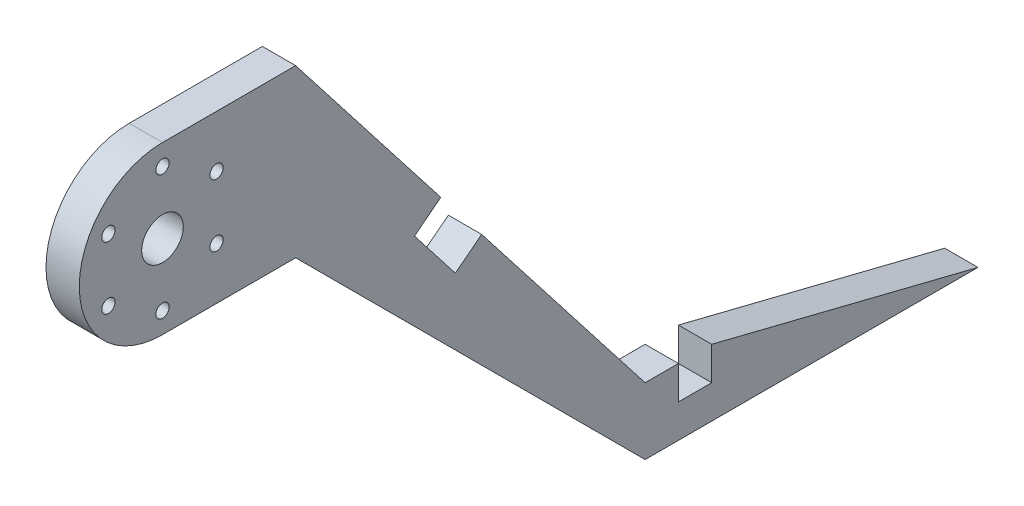
ISO-10303-21;
HEADER;
FILE_DESCRIPTION(('STEP AP214'),'2;1');
FILE_NAME('part.step','',(''),(''),'','','');
FILE_SCHEMA(('AUTOMOTIVE_DESIGN { 1 0 10303 214 1 1 1 1 }'));
ENDSEC;
DATA;
#1=APPLICATION_CONTEXT('core data for automotive mechanical design processes');
#2=APPLICATION_PROTOCOL_DEFINITION('international standard','automotive_design',2000,#1);
#3=PRODUCT_CONTEXT('',#1,'mechanical');
#4=PRODUCT('Part','Part','',(#3));
#5=PRODUCT_RELATED_PRODUCT_CATEGORY('part','',(#4));
#6=PRODUCT_DEFINITION_FORMATION('','',#4);
#7=PRODUCT_DEFINITION_CONTEXT('part definition',#1,'design');
#8=PRODUCT_DEFINITION('design','',#6,#7);
#9=PRODUCT_DEFINITION_SHAPE('','',#8);
#10=(LENGTH_UNIT() NAMED_UNIT(*) SI_UNIT(.MILLI.,.METRE.));
#11=(NAMED_UNIT(*) PLANE_ANGLE_UNIT() SI_UNIT($,.RADIAN.));
#12=(NAMED_UNIT(*) SI_UNIT($,.STERADIAN.) SOLID_ANGLE_UNIT());
#13=UNCERTAINTY_MEASURE_WITH_UNIT(LENGTH_MEASURE(1.E-05),#10,'distance_accuracy_value','');
#14=(GEOMETRIC_REPRESENTATION_CONTEXT(3) GLOBAL_UNCERTAINTY_ASSIGNED_CONTEXT((#13)) GLOBAL_UNIT_ASSIGNED_CONTEXT((#10,
#11,#12)) REPRESENTATION_CONTEXT('',''));
#15=CARTESIAN_POINT('',(0.,0.,0.));
#16=DIRECTION('',(0.,0.,1.));
#17=DIRECTION('',(1.,0.,0.));
#18=AXIS2_PLACEMENT_3D('',#15,#16,#17);
#19=CARTESIAN_POINT('',(12.7,-139.7,-184.150000000001));
#20=DIRECTION('',(0.,-0.613940613514922,0.789352217376325));
#21=DIRECTION('',(0.,-0.789352217376325,-0.613940613514922));
#22=AXIS2_PLACEMENT_3D('',#19,#20,#21);
#23=PLANE('',#22);
#24=DIRECTION('',(0.,0.789352217376325,0.613940613514922));
#25=VECTOR('',#24,1.);
#26=CARTESIAN_POINT('',(12.7,-139.7,-184.150000000001));
#27=LINE('',#26,#25);
#28=CARTESIAN_POINT('',(12.7,-39.4522683932067,-106.179542083605));
#29=VERTEX_POINT('',#28);
#30=CARTESIAN_POINT('',(12.7,31.75,-50.8));
#31=VERTEX_POINT('',#30);
#32=EDGE_CURVE('E236',#29,#31,#27,.T.);
#33=ORIENTED_EDGE('',*,*,#32,.F.);
#34=DIRECTION('',(1.,0.,0.));
#35=VECTOR('',#34,1.);
#36=CARTESIAN_POINT('',(12.7,-39.4522683932067,-106.179542083605));
#37=LINE('',#36,#35);
#38=CARTESIAN_POINT('',(0.,-39.4522683932067,-106.179542083605));
#39=VERTEX_POINT('',#38);
#40=EDGE_CURVE('E279',#39,#29,#37,.T.);
#41=ORIENTED_EDGE('',*,*,#40,.F.);
#42=DIRECTION('',(0.,0.789352217376325,0.613940613514922));
#43=VECTOR('',#42,1.);
#44=CARTESIAN_POINT('',(0.,-139.7,-184.150000000001));
#45=LINE('',#44,#43);
#46=CARTESIAN_POINT('',(0.,31.75,-50.8));
#47=VERTEX_POINT('',#46);
#48=EDGE_CURVE('E180',#39,#47,#45,.T.);
#49=ORIENTED_EDGE('',*,*,#48,.T.);
#50=DIRECTION('',(-1.,0.,0.));
#51=VECTOR('',#50,1.);
#52=CARTESIAN_POINT('',(12.7,31.75,-50.8));
#53=LINE('',#52,#51);
#54=EDGE_CURVE('E199',#31,#47,#53,.T.);
#55=ORIENTED_EDGE('',*,*,#54,.F.);
#56=EDGE_LOOP('',(#33,#41,#49,#55));
#57=FACE_BOUND('',#56,.T.);
#58=ADVANCED_FACE('F39',(#57),#23,.F.);
#59=CARTESIAN_POINT('',(12.7,-165.1,-311.15));
#60=DIRECTION('',(0.,-0.970142500145331,0.242535625036335));
#61=DIRECTION('',(0.,-0.242535625036335,-0.970142500145331));
#62=AXIS2_PLACEMENT_3D('',#59,#60,#61);
#63=PLANE('',#62);
#64=DIRECTION('',(0.,0.242535625036335,0.970142500145332));
#65=VECTOR('',#64,1.);
#66=CARTESIAN_POINT('',(0.,-165.1,-311.15));
#67=LINE('',#66,#65);
#68=CARTESIAN_POINT('',(0.,-165.1,-311.15));
#69=VERTEX_POINT('',#68);
#70=CARTESIAN_POINT('',(0.,-139.7,-209.550000000001));
#71=VERTEX_POINT('',#70);
#72=EDGE_CURVE('E168',#69,#71,#67,.T.);
#73=ORIENTED_EDGE('',*,*,#72,.T.);
#74=DIRECTION('',(-1.,0.,0.));
#75=VECTOR('',#74,1.);
#76=CARTESIAN_POINT('',(12.7,-139.7,-209.550000000001));
#77=LINE('',#76,#75);
#78=CARTESIAN_POINT('',(12.7,-139.7,-209.550000000001));
#79=VERTEX_POINT('',#78);
#80=EDGE_CURVE('E11',#79,#71,#77,.T.);
#81=ORIENTED_EDGE('',*,*,#80,.F.);
#82=DIRECTION('',(0.,0.242535625036335,0.970142500145332));
#83=VECTOR('',#82,1.);
#84=CARTESIAN_POINT('',(12.7,-165.1,-311.15));
#85=LINE('',#84,#83);
#86=CARTESIAN_POINT('',(12.7,-165.1,-311.15));
#87=VERTEX_POINT('',#86);
#88=EDGE_CURVE('E192',#87,#79,#85,.T.);
#89=ORIENTED_EDGE('',*,*,#88,.F.);
#90=DIRECTION('',(-1.,0.,0.));
#91=VECTOR('',#90,1.);
#92=CARTESIAN_POINT('',(12.7,-165.1,-311.15));
#93=LINE('',#92,#91);
#94=EDGE_CURVE('E164',#87,#69,#93,.T.);
#95=ORIENTED_EDGE('',*,*,#94,.T.);
#96=EDGE_LOOP('',(#73,#81,#89,#95));
#97=FACE_BOUND('',#96,.T.);
#98=ADVANCED_FACE('F41',(#97),#63,.F.);
#99=CARTESIAN_POINT('',(12.7,-139.7,-209.550000000001));
#100=DIRECTION('',(0.,0.,-1.));
#101=DIRECTION('',(0.,1.,0.));
#102=AXIS2_PLACEMENT_3D('',#99,#100,#101);
#103=PLANE('',#102);
#104=DIRECTION('',(0.,-1.,0.));
#105=VECTOR('',#104,1.);
#106=CARTESIAN_POINT('',(0.,-139.7,-209.550000000001));
#107=LINE('',#106,#105);
#108=CARTESIAN_POINT('',(0.,-152.4,-209.550000000001));
#109=VERTEX_POINT('',#108);
#110=EDGE_CURVE('E171',#71,#109,#107,.T.);
#111=ORIENTED_EDGE('',*,*,#110,.T.);
#112=DIRECTION('',(-1.,0.,0.));
#113=VECTOR('',#112,1.);
#114=CARTESIAN_POINT('',(12.7,-152.4,-209.550000000001));
#115=LINE('',#114,#113);
#116=CARTESIAN_POINT('',(12.7,-152.4,-209.550000000001));
#117=VERTEX_POINT('',#116);
#118=EDGE_CURVE('E47',#117,#109,#115,.T.);
#119=ORIENTED_EDGE('',*,*,#118,.F.);
#120=DIRECTION('',(0.,-1.,0.));
#121=VECTOR('',#120,1.);
#122=CARTESIAN_POINT('',(12.7,-139.7,-209.550000000001));
#123=LINE('',#122,#121);
#124=EDGE_CURVE('E113',#79,#117,#123,.T.);
#125=ORIENTED_EDGE('',*,*,#124,.F.);
#126=ORIENTED_EDGE('',*,*,#80,.T.);
#127=EDGE_LOOP('',(#111,#119,#125,#126));
#128=FACE_BOUND('',#127,.T.);
#129=ADVANCED_FACE('F370',(#128),#103,.F.);
#130=CARTESIAN_POINT('',(12.7,-152.4,-209.550000000001));
#131=DIRECTION('',(0.,-1.,0.));
#132=DIRECTION('',(0.,0.,-1.));
#133=AXIS2_PLACEMENT_3D('',#130,#131,#132);
#134=PLANE('',#133);
#135=DIRECTION('',(0.,0.,1.));
#136=VECTOR('',#135,1.);
#137=CARTESIAN_POINT('',(0.,-152.4,-209.550000000001));
#138=LINE('',#137,#136);
#139=CARTESIAN_POINT('',(0.,-152.4,-196.850000000001));
#140=VERTEX_POINT('',#139);
#141=EDGE_CURVE('E174',#109,#140,#138,.T.);
#142=ORIENTED_EDGE('',*,*,#141,.T.);
#143=DIRECTION('',(-1.,0.,0.));
#144=VECTOR('',#143,1.);
#145=CARTESIAN_POINT('',(12.7,-152.4,-196.850000000001));
#146=LINE('',#145,#144);
#147=CARTESIAN_POINT('',(12.7,-152.4,-196.850000000001));
#148=VERTEX_POINT('',#147);
#149=EDGE_CURVE('E208',#148,#140,#146,.T.);
#150=ORIENTED_EDGE('',*,*,#149,.F.);
#151=DIRECTION('',(0.,0.,1.));
#152=VECTOR('',#151,1.);
#153=CARTESIAN_POINT('',(12.7,-152.4,-209.550000000001));
#154=LINE('',#153,#152);
#155=EDGE_CURVE('E216',#117,#148,#154,.T.);
#156=ORIENTED_EDGE('',*,*,#155,.F.);
#157=ORIENTED_EDGE('',*,*,#118,.T.);
#158=EDGE_LOOP('',(#142,#150,#156,#157));
#159=FACE_BOUND('',#158,.T.);
#160=ADVANCED_FACE('F214',(#159),#134,.F.);
#161=CARTESIAN_POINT('',(12.7,-152.4,-196.850000000001));
#162=DIRECTION('',(0.,0.,1.));
#163=DIRECTION('',(1.,0.,0.));
#164=AXIS2_PLACEMENT_3D('',#161,#162,#163);
#165=PLANE('',#164);
#166=DIRECTION('',(0.,1.,0.));
#167=VECTOR('',#166,1.);
#168=CARTESIAN_POINT('',(0.,-152.4,-196.850000000001));
#169=LINE('',#168,#167);
#170=CARTESIAN_POINT('',(0.,-139.7,-196.850000000001));
#171=VERTEX_POINT('',#170);
#172=EDGE_CURVE('E176',#140,#171,#169,.T.);
#173=ORIENTED_EDGE('',*,*,#172,.T.);
#174=DIRECTION('',(-1.,0.,0.));
#175=VECTOR('',#174,1.);
#176=CARTESIAN_POINT('',(12.7,-139.7,-196.850000000001));
#177=LINE('',#176,#175);
#178=CARTESIAN_POINT('',(12.7,-139.7,-196.850000000001));
#179=VERTEX_POINT('',#178);
#180=EDGE_CURVE('E205',#179,#171,#177,.T.);
#181=ORIENTED_EDGE('',*,*,#180,.F.);
#182=DIRECTION('',(0.,1.,0.));
#183=VECTOR('',#182,1.);
#184=CARTESIAN_POINT('',(12.7,-152.4,-196.850000000001));
#185=LINE('',#184,#183);
#186=EDGE_CURVE('E237',#148,#179,#185,.T.);
#187=ORIENTED_EDGE('',*,*,#186,.F.);
#188=ORIENTED_EDGE('',*,*,#149,.T.);
#189=EDGE_LOOP('',(#173,#181,#187,#188));
#190=FACE_BOUND('',#189,.T.);
#191=ADVANCED_FACE('F227',(#190),#165,.F.);
#192=CARTESIAN_POINT('',(12.7,-139.7,-196.850000000001));
#193=DIRECTION('',(0.,-1.,0.));
#194=DIRECTION('',(0.,0.,-1.));
#195=AXIS2_PLACEMENT_3D('',#192,#193,#194);
#196=PLANE('',#195);
#197=DIRECTION('',(0.,0.,1.));
#198=VECTOR('',#197,1.);
#199=CARTESIAN_POINT('',(0.,-139.7,-196.850000000001));
#200=LINE('',#199,#198);
#201=CARTESIAN_POINT('',(0.,-139.7,-184.150000000001));
#202=VERTEX_POINT('',#201);
#203=EDGE_CURVE('E178',#171,#202,#200,.T.);
#204=ORIENTED_EDGE('',*,*,#203,.T.);
#205=DIRECTION('',(-1.,0.,0.));
#206=VECTOR('',#205,1.);
#207=CARTESIAN_POINT('',(12.7,-139.7,-184.150000000001));
#208=LINE('',#207,#206);
#209=CARTESIAN_POINT('',(12.7,-139.7,-184.150000000001));
#210=VERTEX_POINT('',#209);
#211=EDGE_CURVE('E202',#210,#202,#208,.T.);
#212=ORIENTED_EDGE('',*,*,#211,.F.);
#213=DIRECTION('',(0.,0.,1.));
#214=VECTOR('',#213,1.);
#215=CARTESIAN_POINT('',(12.7,-139.7,-196.850000000001));
#216=LINE('',#215,#214);
#217=EDGE_CURVE('E233',#179,#210,#216,.T.);
#218=ORIENTED_EDGE('',*,*,#217,.F.);
#219=ORIENTED_EDGE('',*,*,#180,.T.);
#220=EDGE_LOOP('',(#204,#212,#218,#219));
#221=FACE_BOUND('',#220,.T.);
#222=ADVANCED_FACE('F231',(#221),#196,.F.);
#223=CARTESIAN_POINT('',(0.,-59.5018147145653,-121.773633666885));
#224=VERTEX_POINT('',#223);
#225=EDGE_CURVE('E181',#202,#224,#45,.T.);
#226=ORIENTED_EDGE('',*,*,#225,.T.);
#227=DIRECTION('',(-1.,0.,0.));
#228=VECTOR('',#227,1.);
#229=CARTESIAN_POINT('',(12.7,-59.5018147145653,-121.773633666885));
#230=LINE('',#229,#228);
#231=CARTESIAN_POINT('',(12.7,-59.5018147145653,-121.773633666885));
#232=VERTEX_POINT('',#231);
#233=EDGE_CURVE('E283',#232,#224,#230,.T.);
#234=ORIENTED_EDGE('',*,*,#233,.F.);
#235=EDGE_CURVE('E239',#210,#232,#27,.T.);
#236=ORIENTED_EDGE('',*,*,#235,.F.);
#237=ORIENTED_EDGE('',*,*,#211,.T.);
#238=EDGE_LOOP('',(#226,#234,#236,#237));
#239=FACE_BOUND('',#238,.T.);
#240=ADVANCED_FACE('F366',(#239),#23,.F.);
#241=CARTESIAN_POINT('',(12.7,31.75,0.));
#242=DIRECTION('',(0.,-1.,0.));
#243=DIRECTION('',(0.,0.,-1.));
#244=AXIS2_PLACEMENT_3D('',#241,#242,#243);
#245=PLANE('',#244);
#246=DIRECTION('',(0.,0.,1.));
#247=VECTOR('',#246,1.);
#248=CARTESIAN_POINT('',(0.,31.75,0.));
#249=LINE('',#248,#247);
#250=CARTESIAN_POINT('',(0.,31.75,0.));
#251=VERTEX_POINT('',#250);
#252=EDGE_CURVE('E184',#47,#251,#249,.T.);
#253=ORIENTED_EDGE('',*,*,#252,.T.);
#254=DIRECTION('',(-1.,0.,0.));
#255=VECTOR('',#254,1.);
#256=CARTESIAN_POINT('',(12.7,31.75,0.));
#257=LINE('',#256,#255);
#258=CARTESIAN_POINT('',(12.7,31.75,0.));
#259=VERTEX_POINT('',#258);
#260=EDGE_CURVE('E196',#259,#251,#257,.T.);
#261=ORIENTED_EDGE('',*,*,#260,.F.);
#262=DIRECTION('',(0.,0.,1.));
#263=VECTOR('',#262,1.);
#264=CARTESIAN_POINT('',(12.7,31.75,0.));
#265=LINE('',#264,#263);
#266=EDGE_CURVE('E244',#31,#259,#265,.T.);
#267=ORIENTED_EDGE('',*,*,#266,.F.);
#268=ORIENTED_EDGE('',*,*,#54,.T.);
#269=EDGE_LOOP('',(#253,#261,#267,#268));
#270=FACE_BOUND('',#269,.T.);
#271=ADVANCED_FACE('F250',(#270),#245,.F.);
#272=CARTESIAN_POINT('',(12.7,0.,0.));
#273=DIRECTION('',(-1.,0.,0.));
#274=DIRECTION('',(0.,0.,1.));
#275=AXIS2_PLACEMENT_3D('',#272,#273,#274);
#276=CYLINDRICAL_SURFACE('',#275,31.75);
#277=CARTESIAN_POINT('',(0.,0.,0.));
#278=DIRECTION('',(1.,0.,0.));
#279=DIRECTION('',(0.,0.,-1.));
#280=AXIS2_PLACEMENT_3D('',#277,#278,#279);
#281=CIRCLE('',#280,31.75);
#282=CARTESIAN_POINT('',(0.,-31.75,0.));
#283=VERTEX_POINT('',#282);
#284=EDGE_CURVE('E186',#251,#283,#281,.T.);
#285=ORIENTED_EDGE('',*,*,#284,.T.);
#286=DIRECTION('',(-1.,0.,0.));
#287=VECTOR('',#286,1.);
#288=CARTESIAN_POINT('',(12.7,-31.75,0.));
#289=LINE('',#288,#287);
#290=CARTESIAN_POINT('',(12.7,-31.75,0.));
#291=VERTEX_POINT('',#290);
#292=EDGE_CURVE('E159',#291,#283,#289,.T.);
#293=ORIENTED_EDGE('',*,*,#292,.F.);
#294=CARTESIAN_POINT('',(12.7,0.,0.));
#295=DIRECTION('',(1.,0.,0.));
#296=DIRECTION('',(0.,0.,-1.));
#297=AXIS2_PLACEMENT_3D('',#294,#295,#296);
#298=CIRCLE('',#297,31.75);
#299=EDGE_CURVE('E147',#259,#291,#298,.T.);
#300=ORIENTED_EDGE('',*,*,#299,.F.);
#301=ORIENTED_EDGE('',*,*,#260,.T.);
#302=EDGE_LOOP('',(#285,#293,#300,#301));
#303=FACE_BOUND('',#302,.T.);
#304=ADVANCED_FACE('F254',(#303),#276,.T.);
#305=CARTESIAN_POINT('',(12.7,-31.75,0.));
#306=DIRECTION('',(0.,1.,0.));
#307=DIRECTION('',(0.,0.,1.));
#308=AXIS2_PLACEMENT_3D('',#305,#306,#307);
#309=PLANE('',#308);
#310=DIRECTION('',(0.,0.,-1.));
#311=VECTOR('',#310,1.);
#312=CARTESIAN_POINT('',(0.,-31.75,0.));
#313=LINE('',#312,#311);
#314=CARTESIAN_POINT('',(0.,-31.75,-50.8));
#315=VERTEX_POINT('',#314);
#316=EDGE_CURVE('E156',#283,#315,#313,.T.);
#317=ORIENTED_EDGE('',*,*,#316,.T.);
#318=DIRECTION('',(-1.,0.,0.));
#319=VECTOR('',#318,1.);
#320=CARTESIAN_POINT('',(12.7,-31.75,-50.8));
#321=LINE('',#320,#319);
#322=CARTESIAN_POINT('',(12.7,-31.75,-50.8));
#323=VERTEX_POINT('',#322);
#324=EDGE_CURVE('E153',#323,#315,#321,.T.);
#325=ORIENTED_EDGE('',*,*,#324,.F.);
#326=DIRECTION('',(0.,0.,-1.));
#327=VECTOR('',#326,1.);
#328=CARTESIAN_POINT('',(12.7,-31.75,0.));
#329=LINE('',#328,#327);
#330=EDGE_CURVE('E138',#291,#323,#329,.T.);
#331=ORIENTED_EDGE('',*,*,#330,.F.);
#332=ORIENTED_EDGE('',*,*,#292,.T.);
#333=EDGE_LOOP('',(#317,#325,#331,#332));
#334=FACE_BOUND('',#333,.T.);
#335=ADVANCED_FACE('F154',(#334),#309,.F.);
#336=CARTESIAN_POINT('',(12.7,-31.75,-50.8));
#337=DIRECTION('',(0.,0.707106781186547,-0.707106781186548));
#338=DIRECTION('',(0.,0.707106781186548,0.707106781186547));
#339=AXIS2_PLACEMENT_3D('',#336,#337,#338);
#340=PLANE('',#339);
#341=DIRECTION('',(0.,-0.707106781186548,-0.707106781186546));
#342=VECTOR('',#341,1.);
#343=CARTESIAN_POINT('',(0.,-31.75,-50.8));
#344=LINE('',#343,#342);
#345=CARTESIAN_POINT('',(0.,-165.1,-184.15));
#346=VERTEX_POINT('',#345);
#347=EDGE_CURVE('E189',#315,#346,#344,.T.);
#348=ORIENTED_EDGE('',*,*,#347,.T.);
#349=DIRECTION('',(-1.,0.,0.));
#350=VECTOR('',#349,1.);
#351=CARTESIAN_POINT('',(12.7,-165.1,-184.15));
#352=LINE('',#351,#350);
#353=CARTESIAN_POINT('',(12.7,-165.1,-184.15));
#354=VERTEX_POINT('',#353);
#355=EDGE_CURVE('E160',#354,#346,#352,.T.);
#356=ORIENTED_EDGE('',*,*,#355,.F.);
#357=DIRECTION('',(0.,-0.707106781186548,-0.707106781186546));
#358=VECTOR('',#357,1.);
#359=CARTESIAN_POINT('',(12.7,-31.75,-50.8));
#360=LINE('',#359,#358);
#361=EDGE_CURVE('E144',#323,#354,#360,.T.);
#362=ORIENTED_EDGE('',*,*,#361,.F.);
#363=ORIENTED_EDGE('',*,*,#324,.T.);
#364=EDGE_LOOP('',(#348,#356,#362,#363));
#365=FACE_BOUND('',#364,.T.);
#366=ADVANCED_FACE('F162',(#365),#340,.F.);
#367=CARTESIAN_POINT('',(12.7,-165.1,-184.15));
#368=DIRECTION('',(0.,1.,0.));
#369=DIRECTION('',(0.,0.,1.));
#370=AXIS2_PLACEMENT_3D('',#367,#368,#369);
#371=PLANE('',#370);
#372=DIRECTION('',(0.,0.,-1.));
#373=VECTOR('',#372,1.);
#374=CARTESIAN_POINT('',(0.,-165.1,-184.15));
#375=LINE('',#374,#373);
#376=EDGE_CURVE('E105',#346,#69,#375,.T.);
#377=ORIENTED_EDGE('',*,*,#376,.T.);
#378=ORIENTED_EDGE('',*,*,#94,.F.);
#379=DIRECTION('',(0.,0.,-1.));
#380=VECTOR('',#379,1.);
#381=CARTESIAN_POINT('',(12.7,-165.1,-184.15));
#382=LINE('',#381,#380);
#383=EDGE_CURVE('E63',#354,#87,#382,.T.);
#384=ORIENTED_EDGE('',*,*,#383,.F.);
#385=ORIENTED_EDGE('',*,*,#355,.T.);
#386=EDGE_LOOP('',(#377,#378,#384,#385));
#387=FACE_BOUND('',#386,.T.);
#388=ADVANCED_FACE('F255',(#387),#371,.F.);
#389=CARTESIAN_POINT('',(12.7,0.,0.));
#390=DIRECTION('',(1.,0.,0.));
#391=DIRECTION('',(0.,0.,-1.));
#392=AXIS2_PLACEMENT_3D('',#389,#390,#391);
#393=PLANE('',#392);
#394=CARTESIAN_POINT('',(12.7,23.8125,0.));
#395=DIRECTION('',(1.,0.,0.));
#396=DIRECTION('',(0.,0.,-1.));
#397=AXIS2_PLACEMENT_3D('',#394,#395,#396);
#398=CIRCLE('',#397,2.54);
#399=CARTESIAN_POINT('',(12.7,23.8125,-2.54));
#400=VERTEX_POINT('',#399);
#401=EDGE_CURVE('E286',#400,#400,#398,.F.);
#402=ORIENTED_EDGE('',*,*,#401,.T.);
#403=EDGE_LOOP('',(#402));
#404=FACE_BOUND('',#403,.T.);
#405=CARTESIAN_POINT('',(12.7,11.90625,-20.6222299276169));
#406=DIRECTION('',(1.,0.,0.));
#407=DIRECTION('',(0.,0.,-1.));
#408=AXIS2_PLACEMENT_3D('',#405,#406,#407);
#409=CIRCLE('',#408,2.54);
#410=CARTESIAN_POINT('',(12.7,11.90625,-23.1622299276169));
#411=VERTEX_POINT('',#410);
#412=EDGE_CURVE('E300',#411,#411,#409,.F.);
#413=ORIENTED_EDGE('',*,*,#412,.T.);
#414=EDGE_LOOP('',(#413));
#415=FACE_BOUND('',#414,.T.);
#416=CARTESIAN_POINT('',(12.7,-11.90625,-20.6222299276169));
#417=DIRECTION('',(1.,0.,0.));
#418=DIRECTION('',(0.,0.,-1.));
#419=AXIS2_PLACEMENT_3D('',#416,#417,#418);
#420=CIRCLE('',#419,2.54);
#421=CARTESIAN_POINT('',(12.7,-11.90625,-23.1622299276169));
#422=VERTEX_POINT('',#421);
#423=EDGE_CURVE('E293',#422,#422,#420,.F.);
#424=ORIENTED_EDGE('',*,*,#423,.T.);
#425=EDGE_LOOP('',(#424));
#426=FACE_BOUND('',#425,.T.);
#427=CARTESIAN_POINT('',(12.7,-23.8125,0.));
#428=DIRECTION('',(1.,0.,0.));
#429=DIRECTION('',(0.,0.,-1.));
#430=AXIS2_PLACEMENT_3D('',#427,#428,#429);
#431=CIRCLE('',#430,2.54);
#432=CARTESIAN_POINT('',(12.7,-23.8125,-2.54));
#433=VERTEX_POINT('',#432);
#434=EDGE_CURVE('E301',#433,#433,#431,.F.);
#435=ORIENTED_EDGE('',*,*,#434,.T.);
#436=EDGE_LOOP('',(#435));
#437=FACE_BOUND('',#436,.T.);
#438=CARTESIAN_POINT('',(12.7,-11.90625,20.6222299276169));
#439=DIRECTION('',(1.,0.,0.));
#440=DIRECTION('',(0.,0.,-1.));
#441=AXIS2_PLACEMENT_3D('',#438,#439,#440);
#442=CIRCLE('',#441,2.54);
#443=CARTESIAN_POINT('',(12.7,-11.90625,18.0822299276169));
#444=VERTEX_POINT('',#443);
#445=EDGE_CURVE('E307',#444,#444,#442,.F.);
#446=ORIENTED_EDGE('',*,*,#445,.T.);
#447=EDGE_LOOP('',(#446));
#448=FACE_BOUND('',#447,.T.);
#449=CARTESIAN_POINT('',(12.7,11.90625,20.6222299276169));
#450=DIRECTION('',(1.,0.,0.));
#451=DIRECTION('',(0.,0.,-1.));
#452=AXIS2_PLACEMENT_3D('',#449,#450,#451);
#453=CIRCLE('',#452,2.54);
#454=CARTESIAN_POINT('',(12.7,11.90625,18.0822299276169));
#455=VERTEX_POINT('',#454);
#456=EDGE_CURVE('E313',#455,#455,#453,.F.);
#457=ORIENTED_EDGE('',*,*,#456,.T.);
#458=EDGE_LOOP('',(#457));
#459=FACE_BOUND('',#458,.T.);
#460=DIRECTION('',(0.,0.613940613514922,-0.789352217376325));
#461=VECTOR('',#460,1.);
#462=CARTESIAN_POINT('',(12.7,-47.2493141848462,-96.1547689229262));
#463=LINE('',#462,#461);
#464=CARTESIAN_POINT('',(12.7,-47.2493141848462,-96.1547689229262));
#465=VERTEX_POINT('',#464);
#466=EDGE_CURVE('E267',#465,#29,#463,.T.);
#467=ORIENTED_EDGE('',*,*,#466,.T.);
#468=ORIENTED_EDGE('',*,*,#32,.T.);
#469=ORIENTED_EDGE('',*,*,#266,.T.);
#470=ORIENTED_EDGE('',*,*,#299,.T.);
#471=ORIENTED_EDGE('',*,*,#330,.T.);
#472=ORIENTED_EDGE('',*,*,#361,.T.);
#473=ORIENTED_EDGE('',*,*,#383,.T.);
#474=ORIENTED_EDGE('',*,*,#88,.T.);
#475=ORIENTED_EDGE('',*,*,#124,.T.);
#476=ORIENTED_EDGE('',*,*,#155,.T.);
#477=ORIENTED_EDGE('',*,*,#186,.T.);
#478=ORIENTED_EDGE('',*,*,#217,.T.);
#479=ORIENTED_EDGE('',*,*,#235,.T.);
#480=DIRECTION('',(0.,0.613940613514922,-0.789352217376325));
#481=VECTOR('',#480,1.);
#482=CARTESIAN_POINT('',(12.7,-67.2988605062049,-111.748860506205));
#483=LINE('',#482,#481);
#484=CARTESIAN_POINT('',(12.7,-67.2988605062049,-111.748860506205));
#485=VERTEX_POINT('',#484);
#486=EDGE_CURVE('E268',#485,#232,#483,.T.);
#487=ORIENTED_EDGE('',*,*,#486,.F.);
#488=DIRECTION('',(0.,-0.789352217376325,-0.613940613514922));
#489=VECTOR('',#488,1.);
#490=CARTESIAN_POINT('',(12.7,-47.2493141848462,-96.1547689229262));
#491=LINE('',#490,#489);
#492=EDGE_CURVE('E282',#465,#485,#491,.T.);
#493=ORIENTED_EDGE('',*,*,#492,.F.);
#494=EDGE_LOOP('',(#467,#468,#469,#470,#471,#472,#473,#474,#475,#476,#477,#478,#479,#487,#493));
#495=FACE_BOUND('',#494,.T.);
#496=CARTESIAN_POINT('',(12.7,0.,0.));
#497=DIRECTION('',(1.,0.,0.));
#498=DIRECTION('',(0.,0.,-1.));
#499=AXIS2_PLACEMENT_3D('',#496,#497,#498);
#500=CIRCLE('',#499,7.9375);
#501=CARTESIAN_POINT('',(12.7,0.,-7.9375));
#502=VERTEX_POINT('',#501);
#503=EDGE_CURVE('E264',#502,#502,#500,.T.);
#504=ORIENTED_EDGE('',*,*,#503,.F.);
#505=EDGE_LOOP('',(#504));
#506=FACE_BOUND('',#505,.T.);
#507=ADVANCED_FACE('F141',(#404,#415,#426,#437,#448,#459,#495,#506),#393,.T.);
#508=CARTESIAN_POINT('',(0.,0.,0.));
#509=DIRECTION('',(1.,0.,0.));
#510=DIRECTION('',(0.,0.,-1.));
#511=AXIS2_PLACEMENT_3D('',#508,#509,#510);
#512=PLANE('',#511);
#513=CARTESIAN_POINT('',(0.,23.8125,0.));
#514=DIRECTION('',(-1.,0.,0.));
#515=DIRECTION('',(0.,0.,1.));
#516=AXIS2_PLACEMENT_3D('',#513,#514,#515);
#517=CIRCLE('',#516,2.54);
#518=CARTESIAN_POINT('',(0.,23.8125,2.54));
#519=VERTEX_POINT('',#518);
#520=EDGE_CURVE('E316',#519,#519,#517,.T.);
#521=ORIENTED_EDGE('',*,*,#520,.F.);
#522=EDGE_LOOP('',(#521));
#523=FACE_BOUND('',#522,.T.);
#524=CARTESIAN_POINT('',(0.,11.90625,-20.6222299276169));
#525=DIRECTION('',(-1.,0.,0.));
#526=DIRECTION('',(0.,0.,1.));
#527=AXIS2_PLACEMENT_3D('',#524,#525,#526);
#528=CIRCLE('',#527,2.54);
#529=CARTESIAN_POINT('',(0.,11.90625,-18.0822299276169));
#530=VERTEX_POINT('',#529);
#531=EDGE_CURVE('E321',#530,#530,#528,.T.);
#532=ORIENTED_EDGE('',*,*,#531,.F.);
#533=EDGE_LOOP('',(#532));
#534=FACE_BOUND('',#533,.T.);
#535=CARTESIAN_POINT('',(0.,-11.90625,-20.6222299276169));
#536=DIRECTION('',(-1.,0.,0.));
#537=DIRECTION('',(0.,0.,1.));
#538=AXIS2_PLACEMENT_3D('',#535,#536,#537);
#539=CIRCLE('',#538,2.54);
#540=CARTESIAN_POINT('',(0.,-11.90625,-18.0822299276169));
#541=VERTEX_POINT('',#540);
#542=EDGE_CURVE('E297',#541,#541,#539,.T.);
#543=ORIENTED_EDGE('',*,*,#542,.F.);
#544=EDGE_LOOP('',(#543));
#545=FACE_BOUND('',#544,.T.);
#546=CARTESIAN_POINT('',(0.,-23.8125,0.));
#547=DIRECTION('',(-1.,0.,0.));
#548=DIRECTION('',(0.,0.,1.));
#549=AXIS2_PLACEMENT_3D('',#546,#547,#548);
#550=CIRCLE('',#549,2.54);
#551=CARTESIAN_POINT('',(0.,-23.8125,2.54));
#552=VERTEX_POINT('',#551);
#553=EDGE_CURVE('E296',#552,#552,#550,.T.);
#554=ORIENTED_EDGE('',*,*,#553,.F.);
#555=EDGE_LOOP('',(#554));
#556=FACE_BOUND('',#555,.T.);
#557=CARTESIAN_POINT('',(0.,-11.90625,20.6222299276169));
#558=DIRECTION('',(-1.,0.,0.));
#559=DIRECTION('',(0.,0.,1.));
#560=AXIS2_PLACEMENT_3D('',#557,#558,#559);
#561=CIRCLE('',#560,2.54);
#562=CARTESIAN_POINT('',(0.,-11.90625,23.1622299276169));
#563=VERTEX_POINT('',#562);
#564=EDGE_CURVE('E304',#563,#563,#561,.T.);
#565=ORIENTED_EDGE('',*,*,#564,.F.);
#566=EDGE_LOOP('',(#565));
#567=FACE_BOUND('',#566,.T.);
#568=CARTESIAN_POINT('',(0.,11.90625,20.6222299276169));
#569=DIRECTION('',(-1.,0.,0.));
#570=DIRECTION('',(0.,0.,1.));
#571=AXIS2_PLACEMENT_3D('',#568,#569,#570);
#572=CIRCLE('',#571,2.54);
#573=CARTESIAN_POINT('',(0.,11.90625,23.1622299276169));
#574=VERTEX_POINT('',#573);
#575=EDGE_CURVE('E310',#574,#574,#572,.T.);
#576=ORIENTED_EDGE('',*,*,#575,.F.);
#577=EDGE_LOOP('',(#576));
#578=FACE_BOUND('',#577,.T.);
#579=ORIENTED_EDGE('',*,*,#48,.F.);
#580=DIRECTION('',(0.,0.613940613514922,-0.789352217376325));
#581=VECTOR('',#580,1.);
#582=CARTESIAN_POINT('',(0.,-47.2493141848462,-96.1547689229262));
#583=LINE('',#582,#581);
#584=CARTESIAN_POINT('',(0.,-47.2493141848462,-96.1547689229262));
#585=VERTEX_POINT('',#584);
#586=EDGE_CURVE('E275',#585,#39,#583,.T.);
#587=ORIENTED_EDGE('',*,*,#586,.F.);
#588=DIRECTION('',(0.,0.789352217376325,0.613940613514922));
#589=VECTOR('',#588,1.);
#590=CARTESIAN_POINT('',(0.,-47.2493141848462,-96.1547689229262));
#591=LINE('',#590,#589);
#592=CARTESIAN_POINT('',(0.,-67.2988605062049,-111.748860506205));
#593=VERTEX_POINT('',#592);
#594=EDGE_CURVE('E289',#593,#585,#591,.T.);
#595=ORIENTED_EDGE('',*,*,#594,.F.);
#596=DIRECTION('',(0.,0.613940613514922,-0.789352217376325));
#597=VECTOR('',#596,1.);
#598=CARTESIAN_POINT('',(0.,-67.2988605062049,-111.748860506205));
#599=LINE('',#598,#597);
#600=EDGE_CURVE('E271',#593,#224,#599,.T.);
#601=ORIENTED_EDGE('',*,*,#600,.T.);
#602=ORIENTED_EDGE('',*,*,#225,.F.);
#603=ORIENTED_EDGE('',*,*,#203,.F.);
#604=ORIENTED_EDGE('',*,*,#172,.F.);
#605=ORIENTED_EDGE('',*,*,#141,.F.);
#606=ORIENTED_EDGE('',*,*,#110,.F.);
#607=ORIENTED_EDGE('',*,*,#72,.F.);
#608=ORIENTED_EDGE('',*,*,#376,.F.);
#609=ORIENTED_EDGE('',*,*,#347,.F.);
#610=ORIENTED_EDGE('',*,*,#316,.F.);
#611=ORIENTED_EDGE('',*,*,#284,.F.);
#612=ORIENTED_EDGE('',*,*,#252,.F.);
#613=EDGE_LOOP('',(#579,#587,#595,#601,#602,#603,#604,#605,#606,#607,#608,#609,#610,#611,#612));
#614=FACE_BOUND('',#613,.T.);
#615=CARTESIAN_POINT('',(0.,0.,0.));
#616=DIRECTION('',(1.,0.,0.));
#617=DIRECTION('',(0.,0.,-1.));
#618=AXIS2_PLACEMENT_3D('',#615,#616,#617);
#619=CIRCLE('',#618,7.9375);
#620=CARTESIAN_POINT('',(0.,0.,-7.9375));
#621=VERTEX_POINT('',#620);
#622=EDGE_CURVE('E172',#621,#621,#619,.F.);
#623=ORIENTED_EDGE('',*,*,#622,.F.);
#624=EDGE_LOOP('',(#623));
#625=FACE_BOUND('',#624,.T.);
#626=ADVANCED_FACE('F220',(#523,#534,#545,#556,#567,#578,#614,#625),#512,.F.);
#627=CARTESIAN_POINT('',(-22.4506403026729,0.,0.));
#628=DIRECTION('',(1.,0.,0.));
#629=DIRECTION('',(0.,0.,-1.));
#630=AXIS2_PLACEMENT_3D('',#627,#628,#629);
#631=CYLINDRICAL_SURFACE('',#630,7.9375);
#632=ORIENTED_EDGE('',*,*,#622,.T.);
#633=EDGE_LOOP('',(#632));
#634=FACE_BOUND('',#633,.T.);
#635=ORIENTED_EDGE('',*,*,#503,.T.);
#636=EDGE_LOOP('',(#635));
#637=FACE_BOUND('',#636,.T.);
#638=ADVANCED_FACE('F334',(#634,#637),#631,.F.);
#639=CARTESIAN_POINT('',(12.7,-47.2493141848462,-96.1547689229262));
#640=DIRECTION('',(0.,0.789352217376325,0.613940613514922));
#641=DIRECTION('',(0.,-0.613940613514922,0.789352217376325));
#642=AXIS2_PLACEMENT_3D('',#639,#640,#641);
#643=PLANE('',#642);
#644=ORIENTED_EDGE('',*,*,#40,.T.);
#645=ORIENTED_EDGE('',*,*,#466,.F.);
#646=DIRECTION('',(1.,0.,0.));
#647=VECTOR('',#646,1.);
#648=CARTESIAN_POINT('',(12.7,-47.2493141848462,-96.1547689229262));
#649=LINE('',#648,#647);
#650=EDGE_CURVE('E272',#585,#465,#649,.T.);
#651=ORIENTED_EDGE('',*,*,#650,.F.);
#652=ORIENTED_EDGE('',*,*,#586,.T.);
#653=EDGE_LOOP('',(#644,#645,#651,#652));
#654=FACE_BOUND('',#653,.T.);
#655=ADVANCED_FACE('F400',(#654),#643,.F.);
#656=CARTESIAN_POINT('',(12.7,-67.2988605062049,-111.748860506205));
#657=DIRECTION('',(0.,-0.789352217376325,-0.613940613514922));
#658=DIRECTION('',(0.,0.613940613514922,-0.789352217376325));
#659=AXIS2_PLACEMENT_3D('',#656,#657,#658);
#660=PLANE('',#659);
#661=ORIENTED_EDGE('',*,*,#233,.T.);
#662=ORIENTED_EDGE('',*,*,#600,.F.);
#663=DIRECTION('',(-1.,0.,0.));
#664=VECTOR('',#663,1.);
#665=CARTESIAN_POINT('',(12.7,-67.2988605062049,-111.748860506205));
#666=LINE('',#665,#664);
#667=EDGE_CURVE('E54',#485,#593,#666,.T.);
#668=ORIENTED_EDGE('',*,*,#667,.F.);
#669=ORIENTED_EDGE('',*,*,#486,.T.);
#670=EDGE_LOOP('',(#661,#662,#668,#669));
#671=FACE_BOUND('',#670,.T.);
#672=ADVANCED_FACE('F387',(#671),#660,.F.);
#673=CARTESIAN_POINT('',(0.,28.7887234391298,-37.0140729931668));
#674=DIRECTION('',(0.,0.613940613514922,-0.789352217376325));
#675=DIRECTION('',(0.,0.789352217376325,0.613940613514922));
#676=AXIS2_PLACEMENT_3D('',#673,#674,#675);
#677=PLANE('',#676);
#678=ORIENTED_EDGE('',*,*,#492,.T.);
#679=ORIENTED_EDGE('',*,*,#667,.T.);
#680=ORIENTED_EDGE('',*,*,#594,.T.);
#681=ORIENTED_EDGE('',*,*,#650,.T.);
#682=EDGE_LOOP('',(#678,#679,#680,#681));
#683=FACE_BOUND('',#682,.T.);
#684=ADVANCED_FACE('F350',(#683),#677,.T.);
#685=CARTESIAN_POINT('',(19.8842048968553,11.90625,20.6222299276169));
#686=DIRECTION('',(-1.,0.,0.));
#687=DIRECTION('',(0.,0.,1.));
#688=AXIS2_PLACEMENT_3D('',#685,#686,#687);
#689=CYLINDRICAL_SURFACE('',#688,2.54);
#690=ORIENTED_EDGE('',*,*,#575,.T.);
#691=EDGE_LOOP('',(#690));
#692=FACE_BOUND('',#691,.T.);
#693=ORIENTED_EDGE('',*,*,#456,.F.);
#694=EDGE_LOOP('',(#693));
#695=FACE_BOUND('',#694,.T.);
#696=ADVANCED_FACE('F346',(#692,#695),#689,.F.);
#697=CARTESIAN_POINT('',(19.8842048968553,-11.90625,20.6222299276169));
#698=DIRECTION('',(-1.,0.,0.));
#699=DIRECTION('',(0.,0.,1.));
#700=AXIS2_PLACEMENT_3D('',#697,#698,#699);
#701=CYLINDRICAL_SURFACE('',#700,2.54);
#702=ORIENTED_EDGE('',*,*,#564,.T.);
#703=EDGE_LOOP('',(#702));
#704=FACE_BOUND('',#703,.T.);
#705=ORIENTED_EDGE('',*,*,#445,.F.);
#706=EDGE_LOOP('',(#705));
#707=FACE_BOUND('',#706,.T.);
#708=ADVANCED_FACE('F349',(#704,#707),#701,.F.);
#709=CARTESIAN_POINT('',(19.8842048968553,-23.8125,0.));
#710=DIRECTION('',(-1.,0.,0.));
#711=DIRECTION('',(0.,0.,1.));
#712=AXIS2_PLACEMENT_3D('',#709,#710,#711);
#713=CYLINDRICAL_SURFACE('',#712,2.54);
#714=ORIENTED_EDGE('',*,*,#553,.T.);
#715=EDGE_LOOP('',(#714));
#716=FACE_BOUND('',#715,.T.);
#717=ORIENTED_EDGE('',*,*,#434,.F.);
#718=EDGE_LOOP('',(#717));
#719=FACE_BOUND('',#718,.T.);
#720=ADVANCED_FACE('F458',(#716,#719),#713,.F.);
#721=CARTESIAN_POINT('',(19.8842048968553,-11.90625,-20.6222299276169));
#722=DIRECTION('',(-1.,0.,0.));
#723=DIRECTION('',(0.,0.,1.));
#724=AXIS2_PLACEMENT_3D('',#721,#722,#723);
#725=CYLINDRICAL_SURFACE('',#724,2.54);
#726=ORIENTED_EDGE('',*,*,#542,.T.);
#727=EDGE_LOOP('',(#726));
#728=FACE_BOUND('',#727,.T.);
#729=ORIENTED_EDGE('',*,*,#423,.F.);
#730=EDGE_LOOP('',(#729));
#731=FACE_BOUND('',#730,.T.);
#732=ADVANCED_FACE('F409',(#728,#731),#725,.F.);
#733=CARTESIAN_POINT('',(19.8842048968553,11.90625,-20.6222299276169));
#734=DIRECTION('',(-1.,0.,0.));
#735=DIRECTION('',(0.,0.,1.));
#736=AXIS2_PLACEMENT_3D('',#733,#734,#735);
#737=CYLINDRICAL_SURFACE('',#736,2.54);
#738=ORIENTED_EDGE('',*,*,#531,.T.);
#739=EDGE_LOOP('',(#738));
#740=FACE_BOUND('',#739,.T.);
#741=ORIENTED_EDGE('',*,*,#412,.F.);
#742=EDGE_LOOP('',(#741));
#743=FACE_BOUND('',#742,.T.);
#744=ADVANCED_FACE('F476',(#740,#743),#737,.F.);
#745=CARTESIAN_POINT('',(19.8842048968553,23.8125,0.));
#746=DIRECTION('',(-1.,0.,0.));
#747=DIRECTION('',(0.,0.,1.));
#748=AXIS2_PLACEMENT_3D('',#745,#746,#747);
#749=CYLINDRICAL_SURFACE('',#748,2.54);
#750=ORIENTED_EDGE('',*,*,#520,.T.);
#751=EDGE_LOOP('',(#750));
#752=FACE_BOUND('',#751,.T.);
#753=ORIENTED_EDGE('',*,*,#401,.F.);
#754=EDGE_LOOP('',(#753));
#755=FACE_BOUND('',#754,.T.);
#756=ADVANCED_FACE('F329',(#752,#755),#749,.F.);
#757=CLOSED_SHELL('',(#58,#98,#129,#160,#191,#222,#240,#271,#304,#335,#366,#388,#507,#626,#638,
#655,#672,#684,#696,#708,#720,#732,#744,#756));
#758=MANIFOLD_SOLID_BREP('B2',#757);
#759=ADVANCED_BREP_SHAPE_REPRESENTATION('',(#18,#758),#14);
#760=SHAPE_DEFINITION_REPRESENTATION(#9,#759);
ENDSEC;
END-ISO-10303-21;
